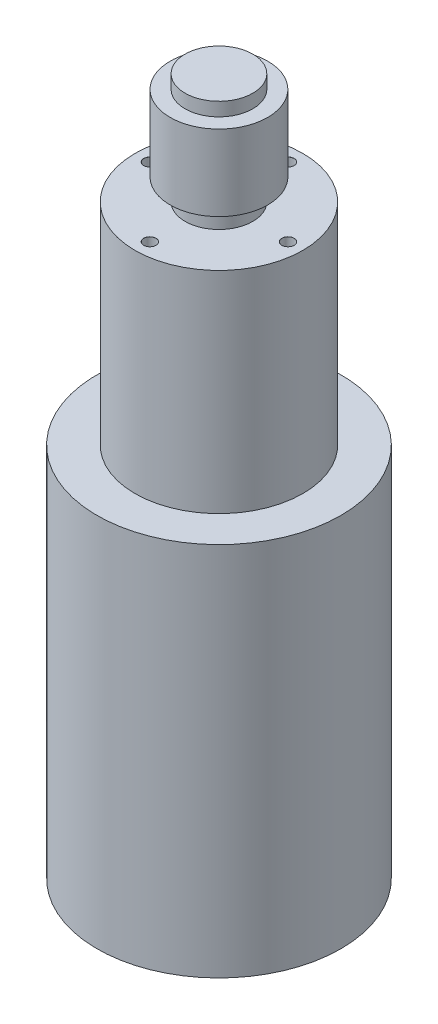
ISO-10303-21;
HEADER;
FILE_DESCRIPTION(('STEP AP214'),'2;1');
FILE_NAME('part.step','',(''),(''),'','','');
FILE_SCHEMA(('AUTOMOTIVE_DESIGN { 1 0 10303 214 1 1 1 1 }'));
ENDSEC;
DATA;
#1=APPLICATION_CONTEXT('core data for automotive mechanical design processes');
#2=APPLICATION_PROTOCOL_DEFINITION('international standard','automotive_design',2000,#1);
#3=PRODUCT_CONTEXT('',#1,'mechanical');
#4=PRODUCT('Part','Part','',(#3));
#5=PRODUCT_RELATED_PRODUCT_CATEGORY('part','',(#4));
#6=PRODUCT_DEFINITION_FORMATION('','',#4);
#7=PRODUCT_DEFINITION_CONTEXT('part definition',#1,'design');
#8=PRODUCT_DEFINITION('design','',#6,#7);
#9=PRODUCT_DEFINITION_SHAPE('','',#8);
#10=(LENGTH_UNIT() NAMED_UNIT(*) SI_UNIT(.MILLI.,.METRE.));
#11=(NAMED_UNIT(*) PLANE_ANGLE_UNIT() SI_UNIT($,.RADIAN.));
#12=(NAMED_UNIT(*) SI_UNIT($,.STERADIAN.) SOLID_ANGLE_UNIT());
#13=UNCERTAINTY_MEASURE_WITH_UNIT(LENGTH_MEASURE(1.E-05),#10,'distance_accuracy_value','');
#14=(GEOMETRIC_REPRESENTATION_CONTEXT(3) GLOBAL_UNCERTAINTY_ASSIGNED_CONTEXT((#13)) GLOBAL_UNIT_ASSIGNED_CONTEXT((#10,
#11,#12)) REPRESENTATION_CONTEXT('',''));
#15=CARTESIAN_POINT('',(0.,0.,0.));
#16=DIRECTION('',(0.,0.,1.));
#17=DIRECTION('',(1.,0.,0.));
#18=AXIS2_PLACEMENT_3D('',#15,#16,#17);
#19=CARTESIAN_POINT('',(0.,257.3,0.));
#20=DIRECTION('',(0.,1.,0.));
#21=DIRECTION('',(-1.,0.,0.));
#22=AXIS2_PLACEMENT_3D('',#19,#20,#21);
#23=PLANE('',#22);
#24=CARTESIAN_POINT('',(-8.82603067413309E-13,257.3,0.));
#25=DIRECTION('',(0.,-1.,0.));
#26=DIRECTION('',(1.,0.,0.));
#27=AXIS2_PLACEMENT_3D('',#24,#25,#26);
#28=CIRCLE('',#27,12.5000000000009);
#29=CARTESIAN_POINT('',(12.5,257.3,0.));
#30=VERTEX_POINT('',#29);
#31=EDGE_CURVE('E11',#30,#30,#28,.T.);
#32=ORIENTED_EDGE('',*,*,#31,.F.);
#33=EDGE_LOOP('',(#32));
#34=FACE_BOUND('',#33,.T.);
#35=ADVANCED_FACE('F33',(#34),#23,.T.);
#36=CARTESIAN_POINT('',(4.05590653340269E-12,-1182.39420366281,0.));
#37=DIRECTION('',(0.,-1.,0.));
#38=DIRECTION('',(1.,0.,0.));
#39=AXIS2_PLACEMENT_3D('',#36,#37,#38);
#40=CYLINDRICAL_SURFACE('',#39,12.5000000000009);
#41=ORIENTED_EDGE('',*,*,#31,.T.);
#42=EDGE_LOOP('',(#41));
#43=FACE_BOUND('',#42,.T.);
#44=CARTESIAN_POINT('',(-8.6545182241888E-13,252.3,0.));
#45=DIRECTION('',(0.,-1.,0.));
#46=DIRECTION('',(1.,0.,0.));
#47=AXIS2_PLACEMENT_3D('',#44,#45,#46);
#48=CIRCLE('',#47,12.5000000000009);
#49=CARTESIAN_POINT('',(12.5,252.3,0.));
#50=VERTEX_POINT('',#49);
#51=EDGE_CURVE('E40',#50,#50,#48,.T.);
#52=ORIENTED_EDGE('',*,*,#51,.F.);
#53=EDGE_LOOP('',(#52));
#54=FACE_BOUND('',#53,.T.);
#55=ADVANCED_FACE('F126',(#43,#54),#40,.T.);
#56=CARTESIAN_POINT('',(12.5,252.3,0.));
#57=DIRECTION('',(0.,1.,0.));
#58=DIRECTION('',(-1.,0.,0.));
#59=AXIS2_PLACEMENT_3D('',#56,#57,#58);
#60=PLANE('',#59);
#61=ORIENTED_EDGE('',*,*,#51,.T.);
#62=EDGE_LOOP('',(#61));
#63=FACE_BOUND('',#62,.T.);
#64=CARTESIAN_POINT('',(-8.6545182241888E-13,252.3,0.));
#65=DIRECTION('',(0.,-1.,0.));
#66=DIRECTION('',(1.,0.,0.));
#67=AXIS2_PLACEMENT_3D('',#64,#65,#66);
#68=CIRCLE('',#67,18.0000000000009);
#69=CARTESIAN_POINT('',(18.,252.3,0.));
#70=VERTEX_POINT('',#69);
#71=EDGE_CURVE('E118',#70,#70,#68,.T.);
#72=ORIENTED_EDGE('',*,*,#71,.F.);
#73=EDGE_LOOP('',(#72));
#74=FACE_BOUND('',#73,.T.);
#75=ADVANCED_FACE('F123',(#63,#74),#60,.T.);
#76=CARTESIAN_POINT('',(4.05590653340269E-12,-1182.39420366281,0.));
#77=DIRECTION('',(0.,-1.,0.));
#78=DIRECTION('',(1.,0.,0.));
#79=AXIS2_PLACEMENT_3D('',#76,#77,#78);
#80=CYLINDRICAL_SURFACE('',#79,18.0000000000008);
#81=ORIENTED_EDGE('',*,*,#71,.T.);
#82=EDGE_LOOP('',(#81));
#83=FACE_BOUND('',#82,.T.);
#84=CARTESIAN_POINT('',(-7.69404850450078E-13,224.3,0.));
#85=DIRECTION('',(0.,-1.,0.));
#86=DIRECTION('',(1.,0.,0.));
#87=AXIS2_PLACEMENT_3D('',#84,#85,#86);
#88=CIRCLE('',#87,18.0000000000008);
#89=CARTESIAN_POINT('',(18.,224.3,0.));
#90=VERTEX_POINT('',#89);
#91=EDGE_CURVE('E115',#90,#90,#88,.T.);
#92=ORIENTED_EDGE('',*,*,#91,.F.);
#93=EDGE_LOOP('',(#92));
#94=FACE_BOUND('',#93,.T.);
#95=ADVANCED_FACE('F133',(#83,#94),#80,.T.);
#96=CARTESIAN_POINT('',(18.,224.3,0.));
#97=DIRECTION('',(0.,-1.,0.));
#98=DIRECTION('',(1.,0.,0.));
#99=AXIS2_PLACEMENT_3D('',#96,#97,#98);
#100=PLANE('',#99);
#101=ORIENTED_EDGE('',*,*,#91,.T.);
#102=EDGE_LOOP('',(#101));
#103=FACE_BOUND('',#102,.T.);
#104=CARTESIAN_POINT('',(-7.69404850450078E-13,224.3,0.));
#105=DIRECTION('',(0.,-1.,0.));
#106=DIRECTION('',(1.,0.,0.));
#107=AXIS2_PLACEMENT_3D('',#104,#105,#106);
#108=CIRCLE('',#107,12.5000000000008);
#109=CARTESIAN_POINT('',(12.5,224.3,0.));
#110=VERTEX_POINT('',#109);
#111=EDGE_CURVE('E112',#110,#110,#108,.T.);
#112=ORIENTED_EDGE('',*,*,#111,.F.);
#113=EDGE_LOOP('',(#112));
#114=FACE_BOUND('',#113,.T.);
#115=ADVANCED_FACE('F139',(#103,#114),#100,.T.);
#116=CARTESIAN_POINT('',(4.05590653340269E-12,-1182.39420366281,0.));
#117=DIRECTION('',(0.,-1.,0.));
#118=DIRECTION('',(1.,0.,0.));
#119=AXIS2_PLACEMENT_3D('',#116,#117,#118);
#120=CYLINDRICAL_SURFACE('',#119,12.5000000000008);
#121=ORIENTED_EDGE('',*,*,#111,.T.);
#122=EDGE_LOOP('',(#121));
#123=FACE_BOUND('',#122,.T.);
#124=CARTESIAN_POINT('',(-7.41962858458992E-13,216.3,0.));
#125=DIRECTION('',(0.,-1.,0.));
#126=DIRECTION('',(1.,0.,0.));
#127=AXIS2_PLACEMENT_3D('',#124,#125,#126);
#128=CIRCLE('',#127,12.5000000000007);
#129=CARTESIAN_POINT('',(12.5,216.3,0.));
#130=VERTEX_POINT('',#129);
#131=EDGE_CURVE('E109',#130,#130,#128,.T.);
#132=ORIENTED_EDGE('',*,*,#131,.F.);
#133=EDGE_LOOP('',(#132));
#134=FACE_BOUND('',#133,.T.);
#135=ADVANCED_FACE('F143',(#123,#134),#120,.T.);
#136=CARTESIAN_POINT('',(12.5,216.3,0.));
#137=DIRECTION('',(0.,1.,0.));
#138=DIRECTION('',(-1.,0.,0.));
#139=AXIS2_PLACEMENT_3D('',#136,#137,#138);
#140=PLANE('',#139);
#141=CARTESIAN_POINT('',(-7.41962858458991E-13,216.3,-25.5));
#142=DIRECTION('',(0.,1.,0.));
#143=DIRECTION('',(0.,0.,1.));
#144=AXIS2_PLACEMENT_3D('',#141,#142,#143);
#145=CIRCLE('',#144,2.275);
#146=CARTESIAN_POINT('',(-7.41962858458991E-13,216.3,-23.225));
#147=VERTEX_POINT('',#146);
#148=EDGE_CURVE('E70',#147,#147,#145,.T.);
#149=ORIENTED_EDGE('',*,*,#148,.F.);
#150=EDGE_LOOP('',(#149));
#151=FACE_BOUND('',#150,.T.);
#152=CARTESIAN_POINT('',(25.4999999999993,216.3,0.));
#153=DIRECTION('',(0.,1.,0.));
#154=DIRECTION('',(0.,0.,1.));
#155=AXIS2_PLACEMENT_3D('',#152,#153,#154);
#156=CIRCLE('',#155,2.275);
#157=CARTESIAN_POINT('',(25.4999999999993,216.3,2.275));
#158=VERTEX_POINT('',#157);
#159=EDGE_CURVE('E63',#158,#158,#156,.T.);
#160=ORIENTED_EDGE('',*,*,#159,.F.);
#161=EDGE_LOOP('',(#160));
#162=FACE_BOUND('',#161,.T.);
#163=CARTESIAN_POINT('',(-7.41962858458991E-13,216.3,25.5));
#164=DIRECTION('',(0.,1.,0.));
#165=DIRECTION('',(0.,0.,1.));
#166=AXIS2_PLACEMENT_3D('',#163,#164,#165);
#167=CIRCLE('',#166,2.275);
#168=CARTESIAN_POINT('',(-7.41962858458991E-13,216.3,27.775));
#169=VERTEX_POINT('',#168);
#170=EDGE_CURVE('E79',#169,#169,#167,.T.);
#171=ORIENTED_EDGE('',*,*,#170,.F.);
#172=EDGE_LOOP('',(#171));
#173=FACE_BOUND('',#172,.T.);
#174=CARTESIAN_POINT('',(-25.5000000000007,216.3,0.));
#175=DIRECTION('',(0.,1.,0.));
#176=DIRECTION('',(0.,0.,1.));
#177=AXIS2_PLACEMENT_3D('',#174,#175,#176);
#178=CIRCLE('',#177,2.275);
#179=CARTESIAN_POINT('',(-25.5000000000007,216.3,2.275));
#180=VERTEX_POINT('',#179);
#181=EDGE_CURVE('E88',#180,#180,#178,.T.);
#182=ORIENTED_EDGE('',*,*,#181,.F.);
#183=EDGE_LOOP('',(#182));
#184=FACE_BOUND('',#183,.T.);
#185=ORIENTED_EDGE('',*,*,#131,.T.);
#186=EDGE_LOOP('',(#185));
#187=FACE_BOUND('',#186,.T.);
#188=CARTESIAN_POINT('',(-7.41962858458992E-13,216.3,0.));
#189=DIRECTION('',(0.,-1.,0.));
#190=DIRECTION('',(1.,0.,0.));
#191=AXIS2_PLACEMENT_3D('',#188,#189,#190);
#192=CIRCLE('',#191,31.0000000000007);
#193=CARTESIAN_POINT('',(31.,216.3,0.));
#194=VERTEX_POINT('',#193);
#195=EDGE_CURVE('E106',#194,#194,#192,.T.);
#196=ORIENTED_EDGE('',*,*,#195,.F.);
#197=EDGE_LOOP('',(#196));
#198=FACE_BOUND('',#197,.T.);
#199=ADVANCED_FACE('F147',(#151,#162,#173,#184,#187,#198),#140,.T.);
#200=CARTESIAN_POINT('',(4.05590653340269E-12,-1182.39420366281,0.));
#201=DIRECTION('',(0.,-1.,0.));
#202=DIRECTION('',(1.,0.,0.));
#203=AXIS2_PLACEMENT_3D('',#200,#201,#202);
#204=CYLINDRICAL_SURFACE('',#203,31.0000000000006);
#205=ORIENTED_EDGE('',*,*,#195,.T.);
#206=EDGE_LOOP('',(#205));
#207=FACE_BOUND('',#206,.T.);
#208=CARTESIAN_POINT('',(-4.75260998795624E-13,138.55,0.));
#209=DIRECTION('',(0.,-1.,0.));
#210=DIRECTION('',(1.,0.,0.));
#211=AXIS2_PLACEMENT_3D('',#208,#209,#210);
#212=CIRCLE('',#211,31.0000000000005);
#213=CARTESIAN_POINT('',(31.,138.55,0.));
#214=VERTEX_POINT('',#213);
#215=EDGE_CURVE('E103',#214,#214,#212,.T.);
#216=ORIENTED_EDGE('',*,*,#215,.F.);
#217=EDGE_LOOP('',(#216));
#218=FACE_BOUND('',#217,.T.);
#219=ADVANCED_FACE('F151',(#207,#218),#204,.T.);
#220=CARTESIAN_POINT('',(31.,138.55,0.));
#221=DIRECTION('',(0.,1.,0.));
#222=DIRECTION('',(-1.,0.,0.));
#223=AXIS2_PLACEMENT_3D('',#220,#221,#222);
#224=PLANE('',#223);
#225=ORIENTED_EDGE('',*,*,#215,.T.);
#226=EDGE_LOOP('',(#225));
#227=FACE_BOUND('',#226,.T.);
#228=CARTESIAN_POINT('',(-4.75260998795623E-13,138.55,0.));
#229=DIRECTION('',(0.,-1.,0.));
#230=DIRECTION('',(1.,0.,0.));
#231=AXIS2_PLACEMENT_3D('',#228,#229,#230);
#232=CIRCLE('',#231,45.0000000000005);
#233=CARTESIAN_POINT('',(45.,138.55,0.));
#234=VERTEX_POINT('',#233);
#235=EDGE_CURVE('E100',#234,#234,#232,.T.);
#236=ORIENTED_EDGE('',*,*,#235,.F.);
#237=EDGE_LOOP('',(#236));
#238=FACE_BOUND('',#237,.T.);
#239=ADVANCED_FACE('F155',(#227,#238),#224,.T.);
#240=CARTESIAN_POINT('',(4.05590653340269E-12,-1182.39420366281,0.));
#241=DIRECTION('',(0.,-1.,0.));
#242=DIRECTION('',(1.,0.,0.));
#243=AXIS2_PLACEMENT_3D('',#240,#241,#242);
#244=CYLINDRICAL_SURFACE('',#243,45.0000000000002);
#245=ORIENTED_EDGE('',*,*,#235,.T.);
#246=EDGE_LOOP('',(#245));
#247=FACE_BOUND('',#246,.T.);
#248=CARTESIAN_POINT('',(0.,-2.22044604925031E-13,0.));
#249=DIRECTION('',(0.,-1.,0.));
#250=DIRECTION('',(1.,0.,0.));
#251=AXIS2_PLACEMENT_3D('',#248,#249,#250);
#252=CIRCLE('',#251,45.);
#253=CARTESIAN_POINT('',(45.,0.,0.));
#254=VERTEX_POINT('',#253);
#255=EDGE_CURVE('E97',#254,#254,#252,.T.);
#256=ORIENTED_EDGE('',*,*,#255,.F.);
#257=EDGE_LOOP('',(#256));
#258=FACE_BOUND('',#257,.T.);
#259=ADVANCED_FACE('F159',(#247,#258),#244,.T.);
#260=CARTESIAN_POINT('',(45.,0.,0.));
#261=DIRECTION('',(0.,-1.,0.));
#262=DIRECTION('',(1.,0.,0.));
#263=AXIS2_PLACEMENT_3D('',#260,#261,#262);
#264=PLANE('',#263);
#265=ORIENTED_EDGE('',*,*,#255,.T.);
#266=EDGE_LOOP('',(#265));
#267=FACE_BOUND('',#266,.T.);
#268=ADVANCED_FACE('F163',(#267),#264,.T.);
#269=CARTESIAN_POINT('',(-25.5000000000007,199.3,0.));
#270=DIRECTION('',(0.,1.,0.));
#271=DIRECTION('',(0.,0.,1.));
#272=AXIS2_PLACEMENT_3D('',#269,#270,#271);
#273=CONICAL_SURFACE('',#272,2.25,1.02974425867666);
#274=CARTESIAN_POINT('',(-25.5000000000007,197.948063607188,0.));
#275=VERTEX_POINT('',#274);
#276=VERTEX_LOOP('',#275);
#277=FACE_BOUND('',#276,.T.);
#278=CARTESIAN_POINT('',(-25.5000000000007,199.3,0.));
#279=DIRECTION('',(0.,1.,0.));
#280=DIRECTION('',(0.,0.,1.));
#281=AXIS2_PLACEMENT_3D('',#278,#279,#280);
#282=CIRCLE('',#281,2.25);
#283=CARTESIAN_POINT('',(-25.5000000000007,199.3,2.25));
#284=VERTEX_POINT('',#283);
#285=EDGE_CURVE('E94',#284,#284,#282,.T.);
#286=ORIENTED_EDGE('',*,*,#285,.T.);
#287=EDGE_LOOP('',(#286));
#288=FACE_BOUND('',#287,.T.);
#289=ADVANCED_FACE('F167',(#277,#288),#273,.F.);
#290=CARTESIAN_POINT('',(-25.5000000000007,216.3,0.));
#291=DIRECTION('',(0.,1.,0.));
#292=DIRECTION('',(0.,0.,1.));
#293=AXIS2_PLACEMENT_3D('',#290,#291,#292);
#294=CYLINDRICAL_SURFACE('',#293,2.25);
#295=ORIENTED_EDGE('',*,*,#285,.F.);
#296=EDGE_LOOP('',(#295));
#297=FACE_BOUND('',#296,.T.);
#298=CARTESIAN_POINT('',(-25.5000000000007,216.275,0.));
#299=DIRECTION('',(0.,1.,0.));
#300=DIRECTION('',(0.,0.,1.));
#301=AXIS2_PLACEMENT_3D('',#298,#299,#300);
#302=CIRCLE('',#301,2.25);
#303=CARTESIAN_POINT('',(-25.5000000000007,216.275,2.25));
#304=VERTEX_POINT('',#303);
#305=EDGE_CURVE('E91',#304,#304,#302,.T.);
#306=ORIENTED_EDGE('',*,*,#305,.T.);
#307=EDGE_LOOP('',(#306));
#308=FACE_BOUND('',#307,.T.);
#309=ADVANCED_FACE('F171',(#297,#308),#294,.F.);
#310=CARTESIAN_POINT('',(-25.5000000000007,216.3,0.));
#311=DIRECTION('',(0.,1.,0.));
#312=DIRECTION('',(0.,0.,1.));
#313=AXIS2_PLACEMENT_3D('',#310,#311,#312);
#314=CONICAL_SURFACE('',#313,2.275,0.785398163397518);
#315=ORIENTED_EDGE('',*,*,#305,.F.);
#316=EDGE_LOOP('',(#315));
#317=FACE_BOUND('',#316,.T.);
#318=ORIENTED_EDGE('',*,*,#181,.T.);
#319=EDGE_LOOP('',(#318));
#320=FACE_BOUND('',#319,.T.);
#321=ADVANCED_FACE('F174',(#317,#320),#314,.F.);
#322=CARTESIAN_POINT('',(-7.41962858458991E-13,199.3,25.5));
#323=DIRECTION('',(0.,1.,0.));
#324=DIRECTION('',(0.,0.,1.));
#325=AXIS2_PLACEMENT_3D('',#322,#323,#324);
#326=CONICAL_SURFACE('',#325,2.25,1.02974425867665);
#327=CARTESIAN_POINT('',(-7.46438464052316E-13,197.948063607188,25.5));
#328=VERTEX_POINT('',#327);
#329=VERTEX_LOOP('',#328);
#330=FACE_BOUND('',#329,.T.);
#331=CARTESIAN_POINT('',(-7.41962858458991E-13,199.3,25.5));
#332=DIRECTION('',(0.,1.,0.));
#333=DIRECTION('',(0.,0.,1.));
#334=AXIS2_PLACEMENT_3D('',#331,#332,#333);
#335=CIRCLE('',#334,2.25);
#336=CARTESIAN_POINT('',(-7.41962858458991E-13,199.3,27.75));
#337=VERTEX_POINT('',#336);
#338=EDGE_CURVE('E85',#337,#337,#335,.T.);
#339=ORIENTED_EDGE('',*,*,#338,.T.);
#340=EDGE_LOOP('',(#339));
#341=FACE_BOUND('',#340,.T.);
#342=ADVANCED_FACE('F178',(#330,#341),#326,.F.);
#343=CARTESIAN_POINT('',(-7.41962858458991E-13,216.3,25.5));
#344=DIRECTION('',(0.,1.,0.));
#345=DIRECTION('',(0.,0.,1.));
#346=AXIS2_PLACEMENT_3D('',#343,#344,#345);
#347=CYLINDRICAL_SURFACE('',#346,2.25);
#348=ORIENTED_EDGE('',*,*,#338,.F.);
#349=EDGE_LOOP('',(#348));
#350=FACE_BOUND('',#349,.T.);
#351=CARTESIAN_POINT('',(-7.41962858458991E-13,216.275,25.5));
#352=DIRECTION('',(0.,1.,0.));
#353=DIRECTION('',(0.,0.,1.));
#354=AXIS2_PLACEMENT_3D('',#351,#352,#353);
#355=CIRCLE('',#354,2.25);
#356=CARTESIAN_POINT('',(-7.41962858458991E-13,216.275,27.75));
#357=VERTEX_POINT('',#356);
#358=EDGE_CURVE('E82',#357,#357,#355,.T.);
#359=ORIENTED_EDGE('',*,*,#358,.T.);
#360=EDGE_LOOP('',(#359));
#361=FACE_BOUND('',#360,.T.);
#362=ADVANCED_FACE('F182',(#350,#361),#347,.F.);
#363=CARTESIAN_POINT('',(-7.41962858458991E-13,216.3,25.5));
#364=DIRECTION('',(0.,1.,0.));
#365=DIRECTION('',(0.,0.,1.));
#366=AXIS2_PLACEMENT_3D('',#363,#364,#365);
#367=CONICAL_SURFACE('',#366,2.275,0.785398163397535);
#368=ORIENTED_EDGE('',*,*,#358,.F.);
#369=EDGE_LOOP('',(#368));
#370=FACE_BOUND('',#369,.T.);
#371=ORIENTED_EDGE('',*,*,#170,.T.);
#372=EDGE_LOOP('',(#371));
#373=FACE_BOUND('',#372,.T.);
#374=ADVANCED_FACE('F185',(#370,#373),#367,.F.);
#375=CARTESIAN_POINT('',(25.4999999999993,199.3,0.));
#376=DIRECTION('',(0.,1.,0.));
#377=DIRECTION('',(0.,0.,1.));
#378=AXIS2_PLACEMENT_3D('',#375,#376,#377);
#379=CONICAL_SURFACE('',#378,2.25,1.02974425867666);
#380=CARTESIAN_POINT('',(25.4999999999993,197.948063607188,0.));
#381=VERTEX_POINT('',#380);
#382=VERTEX_LOOP('',#381);
#383=FACE_BOUND('',#382,.T.);
#384=CARTESIAN_POINT('',(25.4999999999993,199.3,0.));
#385=DIRECTION('',(0.,1.,0.));
#386=DIRECTION('',(0.,0.,1.));
#387=AXIS2_PLACEMENT_3D('',#384,#385,#386);
#388=CIRCLE('',#387,2.25);
#389=CARTESIAN_POINT('',(25.4999999999993,199.3,2.25));
#390=VERTEX_POINT('',#389);
#391=EDGE_CURVE('E76',#390,#390,#388,.T.);
#392=ORIENTED_EDGE('',*,*,#391,.T.);
#393=EDGE_LOOP('',(#392));
#394=FACE_BOUND('',#393,.T.);
#395=ADVANCED_FACE('F189',(#383,#394),#379,.F.);
#396=CARTESIAN_POINT('',(25.4999999999993,216.3,0.));
#397=DIRECTION('',(0.,1.,0.));
#398=DIRECTION('',(0.,0.,1.));
#399=AXIS2_PLACEMENT_3D('',#396,#397,#398);
#400=CYLINDRICAL_SURFACE('',#399,2.25);
#401=ORIENTED_EDGE('',*,*,#391,.F.);
#402=EDGE_LOOP('',(#401));
#403=FACE_BOUND('',#402,.T.);
#404=CARTESIAN_POINT('',(25.4999999999993,216.275,0.));
#405=DIRECTION('',(0.,1.,0.));
#406=DIRECTION('',(0.,0.,1.));
#407=AXIS2_PLACEMENT_3D('',#404,#405,#406);
#408=CIRCLE('',#407,2.25);
#409=CARTESIAN_POINT('',(25.4999999999993,216.275,2.25));
#410=VERTEX_POINT('',#409);
#411=EDGE_CURVE('E67',#410,#410,#408,.T.);
#412=ORIENTED_EDGE('',*,*,#411,.T.);
#413=EDGE_LOOP('',(#412));
#414=FACE_BOUND('',#413,.T.);
#415=ADVANCED_FACE('F193',(#403,#414),#400,.F.);
#416=CARTESIAN_POINT('',(25.4999999999993,216.3,0.));
#417=DIRECTION('',(0.,1.,0.));
#418=DIRECTION('',(0.,0.,1.));
#419=AXIS2_PLACEMENT_3D('',#416,#417,#418);
#420=CONICAL_SURFACE('',#419,2.275,0.785398163397518);
#421=ORIENTED_EDGE('',*,*,#411,.F.);
#422=EDGE_LOOP('',(#421));
#423=FACE_BOUND('',#422,.T.);
#424=ORIENTED_EDGE('',*,*,#159,.T.);
#425=EDGE_LOOP('',(#424));
#426=FACE_BOUND('',#425,.T.);
#427=ADVANCED_FACE('F57',(#423,#426),#420,.F.);
#428=CARTESIAN_POINT('',(-7.41962858458991E-13,199.3,-25.5));
#429=DIRECTION('',(0.,1.,0.));
#430=DIRECTION('',(0.,0.,1.));
#431=AXIS2_PLACEMENT_3D('',#428,#429,#430);
#432=CONICAL_SURFACE('',#431,2.25,1.02974425867665);
#433=CARTESIAN_POINT('',(-7.46438464052316E-13,197.948063607188,-25.5));
#434=VERTEX_POINT('',#433);
#435=VERTEX_LOOP('',#434);
#436=FACE_BOUND('',#435,.T.);
#437=CARTESIAN_POINT('',(-7.41962858458991E-13,199.3,-25.5));
#438=DIRECTION('',(0.,1.,0.));
#439=DIRECTION('',(0.,0.,1.));
#440=AXIS2_PLACEMENT_3D('',#437,#438,#439);
#441=CIRCLE('',#440,2.25);
#442=CARTESIAN_POINT('',(-7.41962858458991E-13,199.3,-23.25));
#443=VERTEX_POINT('',#442);
#444=EDGE_CURVE('E61',#443,#443,#441,.T.);
#445=ORIENTED_EDGE('',*,*,#444,.T.);
#446=EDGE_LOOP('',(#445));
#447=FACE_BOUND('',#446,.T.);
#448=ADVANCED_FACE('F53',(#436,#447),#432,.F.);
#449=CARTESIAN_POINT('',(-7.41962858458991E-13,216.3,-25.5));
#450=DIRECTION('',(0.,1.,0.));
#451=DIRECTION('',(0.,0.,1.));
#452=AXIS2_PLACEMENT_3D('',#449,#450,#451);
#453=CYLINDRICAL_SURFACE('',#452,2.25);
#454=ORIENTED_EDGE('',*,*,#444,.F.);
#455=EDGE_LOOP('',(#454));
#456=FACE_BOUND('',#455,.T.);
#457=CARTESIAN_POINT('',(-7.41962858458991E-13,216.275,-25.5));
#458=DIRECTION('',(0.,1.,0.));
#459=DIRECTION('',(0.,0.,1.));
#460=AXIS2_PLACEMENT_3D('',#457,#458,#459);
#461=CIRCLE('',#460,2.25);
#462=CARTESIAN_POINT('',(-7.41962858458991E-13,216.275,-23.25));
#463=VERTEX_POINT('',#462);
#464=EDGE_CURVE('E64',#463,#463,#461,.T.);
#465=ORIENTED_EDGE('',*,*,#464,.T.);
#466=EDGE_LOOP('',(#465));
#467=FACE_BOUND('',#466,.T.);
#468=ADVANCED_FACE('F56',(#456,#467),#453,.F.);
#469=CARTESIAN_POINT('',(-7.41962858458991E-13,216.3,-25.5));
#470=DIRECTION('',(0.,1.,0.));
#471=DIRECTION('',(0.,0.,1.));
#472=AXIS2_PLACEMENT_3D('',#469,#470,#471);
#473=CONICAL_SURFACE('',#472,2.275,0.785398163397535);
#474=ORIENTED_EDGE('',*,*,#464,.F.);
#475=EDGE_LOOP('',(#474));
#476=FACE_BOUND('',#475,.T.);
#477=ORIENTED_EDGE('',*,*,#148,.T.);
#478=EDGE_LOOP('',(#477));
#479=FACE_BOUND('',#478,.T.);
#480=ADVANCED_FACE('F203',(#476,#479),#473,.F.);
#481=CLOSED_SHELL('',(#35,#55,#75,#95,#115,#135,#199,#219,#239,#259,#268,#289,#309,#321,#342,
#362,#374,#395,#415,#427,#448,#468,#480));
#482=MANIFOLD_SOLID_BREP('B2',#481);
#483=ADVANCED_BREP_SHAPE_REPRESENTATION('',(#18,#482),#14);
#484=SHAPE_DEFINITION_REPRESENTATION(#9,#483);
ENDSEC;
END-ISO-10303-21;
